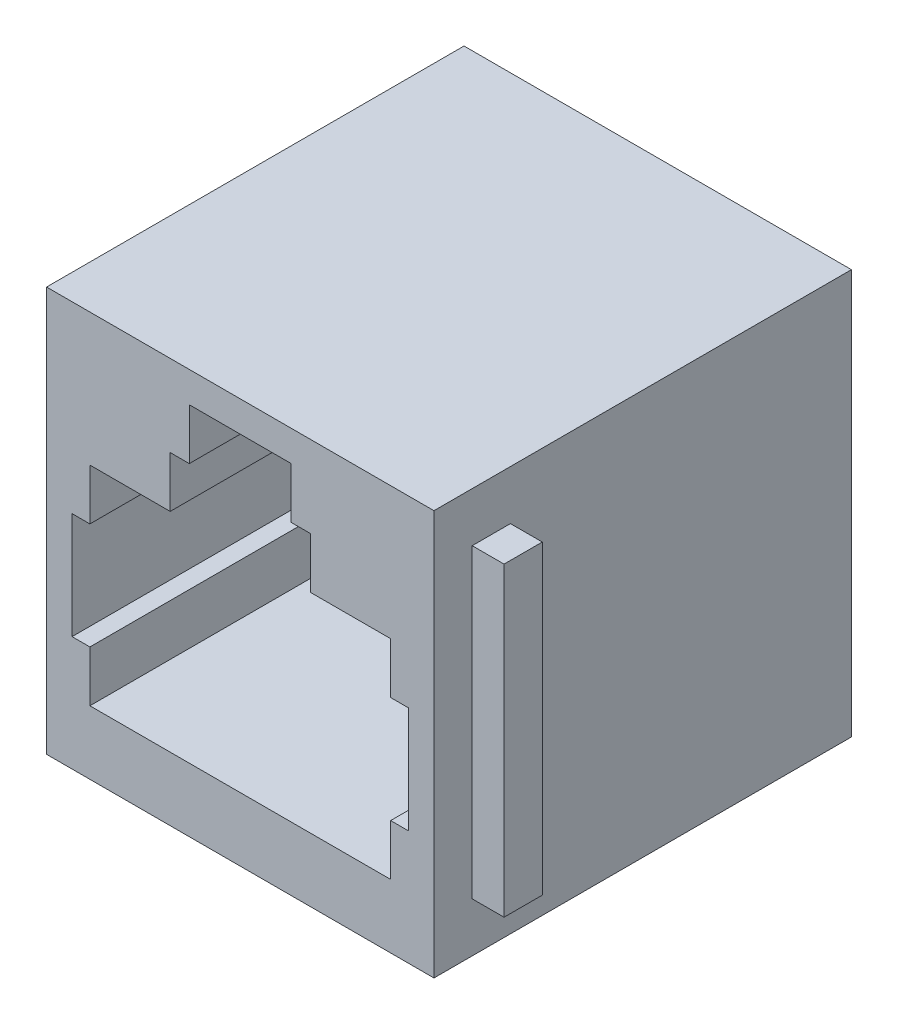
ISO-10303-21;
HEADER;
FILE_DESCRIPTION(('STEP AP214'),'2;1');
FILE_NAME('part.step','',(''),(''),'','','');
FILE_SCHEMA(('AUTOMOTIVE_DESIGN { 1 0 10303 214 1 1 1 1 }'));
ENDSEC;
DATA;
#1=APPLICATION_CONTEXT('core data for automotive mechanical design processes');
#2=APPLICATION_PROTOCOL_DEFINITION('international standard','automotive_design',2000,#1);
#3=PRODUCT_CONTEXT('',#1,'mechanical');
#4=PRODUCT('Part','Part','',(#3));
#5=PRODUCT_RELATED_PRODUCT_CATEGORY('part','',(#4));
#6=PRODUCT_DEFINITION_FORMATION('','',#4);
#7=PRODUCT_DEFINITION_CONTEXT('part definition',#1,'design');
#8=PRODUCT_DEFINITION('design','',#6,#7);
#9=PRODUCT_DEFINITION_SHAPE('','',#8);
#10=(LENGTH_UNIT() NAMED_UNIT(*) SI_UNIT(.MILLI.,.METRE.));
#11=(NAMED_UNIT(*) PLANE_ANGLE_UNIT() SI_UNIT($,.RADIAN.));
#12=(NAMED_UNIT(*) SI_UNIT($,.STERADIAN.) SOLID_ANGLE_UNIT());
#13=UNCERTAINTY_MEASURE_WITH_UNIT(LENGTH_MEASURE(1.E-05),#10,'distance_accuracy_value','');
#14=(GEOMETRIC_REPRESENTATION_CONTEXT(3) GLOBAL_UNCERTAINTY_ASSIGNED_CONTEXT((#13)) GLOBAL_UNIT_ASSIGNED_CONTEXT((#10,
#11,#12)) REPRESENTATION_CONTEXT('',''));
#15=CARTESIAN_POINT('',(0.,0.,0.));
#16=DIRECTION('',(0.,0.,1.));
#17=DIRECTION('',(1.,0.,0.));
#18=AXIS2_PLACEMENT_3D('',#15,#16,#17);
#19=CARTESIAN_POINT('',(-7.6,7.94,16.38));
#20=DIRECTION('',(1.,0.,0.));
#21=DIRECTION('',(0.,1.,0.));
#22=AXIS2_PLACEMENT_3D('',#19,#20,#21);
#23=PLANE('',#22);
#24=DIRECTION('',(0.,-1.,0.));
#25=VECTOR('',#24,1.);
#26=CARTESIAN_POINT('',(-7.6,6.,13.38));
#27=LINE('',#26,#25);
#28=CARTESIAN_POINT('',(-7.6,6.,13.38));
#29=VERTEX_POINT('',#28);
#30=CARTESIAN_POINT('',(-7.6,-6.,13.38));
#31=VERTEX_POINT('',#30);
#32=EDGE_CURVE('E49',#29,#31,#27,.T.);
#33=ORIENTED_EDGE('',*,*,#32,.F.);
#34=DIRECTION('',(0.,0.,-1.));
#35=VECTOR('',#34,1.);
#36=CARTESIAN_POINT('',(-7.6,6.,13.38));
#37=LINE('',#36,#35);
#38=CARTESIAN_POINT('',(-7.6,6.,14.88));
#39=VERTEX_POINT('',#38);
#40=EDGE_CURVE('E53',#39,#29,#37,.T.);
#41=ORIENTED_EDGE('',*,*,#40,.F.);
#42=DIRECTION('',(0.,-1.,0.));
#43=VECTOR('',#42,1.);
#44=CARTESIAN_POINT('',(-7.6,6.,14.88));
#45=LINE('',#44,#43);
#46=CARTESIAN_POINT('',(-7.6,-6.,14.88));
#47=VERTEX_POINT('',#46);
#48=EDGE_CURVE('E266',#39,#47,#45,.T.);
#49=ORIENTED_EDGE('',*,*,#48,.T.);
#50=DIRECTION('',(0.,0.,-1.));
#51=VECTOR('',#50,1.);
#52=CARTESIAN_POINT('',(-7.6,-6.,13.38));
#53=LINE('',#52,#51);
#54=EDGE_CURVE('E257',#47,#31,#53,.T.);
#55=ORIENTED_EDGE('',*,*,#54,.T.);
#56=EDGE_LOOP('',(#33,#41,#49,#55));
#57=FACE_BOUND('',#56,.T.);
#58=DIRECTION('',(0.,-1.,0.));
#59=VECTOR('',#58,1.);
#60=CARTESIAN_POINT('',(-7.6,7.94,0.));
#61=LINE('',#60,#59);
#62=CARTESIAN_POINT('',(-7.6,7.94,0.));
#63=VERTEX_POINT('',#62);
#64=CARTESIAN_POINT('',(-7.6,-7.94,0.));
#65=VERTEX_POINT('',#64);
#66=EDGE_CURVE('E437',#63,#65,#61,.T.);
#67=ORIENTED_EDGE('',*,*,#66,.T.);
#68=DIRECTION('',(0.,0.,-1.));
#69=VECTOR('',#68,1.);
#70=CARTESIAN_POINT('',(-7.6,-7.94,16.38));
#71=LINE('',#70,#69);
#72=CARTESIAN_POINT('',(-7.6,-7.94,16.38));
#73=VERTEX_POINT('',#72);
#74=EDGE_CURVE('E12',#73,#65,#71,.T.);
#75=ORIENTED_EDGE('',*,*,#74,.F.);
#76=DIRECTION('',(0.,-1.,0.));
#77=VECTOR('',#76,1.);
#78=CARTESIAN_POINT('',(-7.6,7.94,16.38));
#79=LINE('',#78,#77);
#80=CARTESIAN_POINT('',(-7.6,7.94,16.38));
#81=VERTEX_POINT('',#80);
#82=EDGE_CURVE('E438',#81,#73,#79,.T.);
#83=ORIENTED_EDGE('',*,*,#82,.F.);
#84=DIRECTION('',(0.,0.,-1.));
#85=VECTOR('',#84,1.);
#86=CARTESIAN_POINT('',(-7.6,7.94,16.38));
#87=LINE('',#86,#85);
#88=EDGE_CURVE('E448',#81,#63,#87,.T.);
#89=ORIENTED_EDGE('',*,*,#88,.T.);
#90=EDGE_LOOP('',(#67,#75,#83,#89));
#91=FACE_BOUND('',#90,.T.);
#92=ADVANCED_FACE('F35',(#57,#91),#23,.F.);
#93=CARTESIAN_POINT('',(-7.6,-7.94,16.38));
#94=DIRECTION('',(0.,1.,0.));
#95=DIRECTION('',(-1.,0.,0.));
#96=AXIS2_PLACEMENT_3D('',#93,#94,#95);
#97=PLANE('',#96);
#98=DIRECTION('',(1.,0.,0.));
#99=VECTOR('',#98,1.);
#100=CARTESIAN_POINT('',(-7.6,-7.94,0.));
#101=LINE('',#100,#99);
#102=CARTESIAN_POINT('',(7.6,-7.94,0.));
#103=VERTEX_POINT('',#102);
#104=EDGE_CURVE('E451',#65,#103,#101,.T.);
#105=ORIENTED_EDGE('',*,*,#104,.T.);
#106=DIRECTION('',(0.,0.,-1.));
#107=VECTOR('',#106,1.);
#108=CARTESIAN_POINT('',(7.6,-7.94,16.38));
#109=LINE('',#108,#107);
#110=CARTESIAN_POINT('',(7.6,-7.94,16.38));
#111=VERTEX_POINT('',#110);
#112=EDGE_CURVE('E42',#111,#103,#109,.T.);
#113=ORIENTED_EDGE('',*,*,#112,.F.);
#114=DIRECTION('',(1.,0.,0.));
#115=VECTOR('',#114,1.);
#116=CARTESIAN_POINT('',(-7.6,-7.94,16.38));
#117=LINE('',#116,#115);
#118=EDGE_CURVE('E441',#73,#111,#117,.T.);
#119=ORIENTED_EDGE('',*,*,#118,.F.);
#120=ORIENTED_EDGE('',*,*,#74,.T.);
#121=EDGE_LOOP('',(#105,#113,#119,#120));
#122=FACE_BOUND('',#121,.T.);
#123=ADVANCED_FACE('F481',(#122),#97,.F.);
#124=CARTESIAN_POINT('',(7.6,7.94,16.38));
#125=DIRECTION('',(-1.,0.,0.));
#126=DIRECTION('',(0.,-1.,0.));
#127=AXIS2_PLACEMENT_3D('',#124,#125,#126);
#128=PLANE('',#127);
#129=DIRECTION('',(0.,-1.,0.));
#130=VECTOR('',#129,1.);
#131=CARTESIAN_POINT('',(7.6,6.,14.88));
#132=LINE('',#131,#130);
#133=CARTESIAN_POINT('',(7.6,6.,14.88));
#134=VERTEX_POINT('',#133);
#135=CARTESIAN_POINT('',(7.6,-6.,14.88));
#136=VERTEX_POINT('',#135);
#137=EDGE_CURVE('E294',#134,#136,#132,.T.);
#138=ORIENTED_EDGE('',*,*,#137,.F.);
#139=DIRECTION('',(0.,0.,1.));
#140=VECTOR('',#139,1.);
#141=CARTESIAN_POINT('',(7.6,6.,13.38));
#142=LINE('',#141,#140);
#143=CARTESIAN_POINT('',(7.6,6.,13.38));
#144=VERTEX_POINT('',#143);
#145=EDGE_CURVE('E270',#144,#134,#142,.T.);
#146=ORIENTED_EDGE('',*,*,#145,.F.);
#147=DIRECTION('',(0.,-1.,0.));
#148=VECTOR('',#147,1.);
#149=CARTESIAN_POINT('',(7.6,6.,13.38));
#150=LINE('',#149,#148);
#151=CARTESIAN_POINT('',(7.6,-6.,13.38));
#152=VERTEX_POINT('',#151);
#153=EDGE_CURVE('E280',#144,#152,#150,.T.);
#154=ORIENTED_EDGE('',*,*,#153,.T.);
#155=DIRECTION('',(0.,0.,1.));
#156=VECTOR('',#155,1.);
#157=CARTESIAN_POINT('',(7.6,-6.,13.38));
#158=LINE('',#157,#156);
#159=EDGE_CURVE('E262',#152,#136,#158,.T.);
#160=ORIENTED_EDGE('',*,*,#159,.T.);
#161=EDGE_LOOP('',(#138,#146,#154,#160));
#162=FACE_BOUND('',#161,.T.);
#163=DIRECTION('',(0.,1.,0.));
#164=VECTOR('',#163,1.);
#165=CARTESIAN_POINT('',(7.6,7.94,0.));
#166=LINE('',#165,#164);
#167=CARTESIAN_POINT('',(7.6,7.94,0.));
#168=VERTEX_POINT('',#167);
#169=EDGE_CURVE('E453',#103,#168,#166,.T.);
#170=ORIENTED_EDGE('',*,*,#169,.T.);
#171=DIRECTION('',(0.,0.,-1.));
#172=VECTOR('',#171,1.);
#173=CARTESIAN_POINT('',(7.6,7.94,16.38));
#174=LINE('',#173,#172);
#175=CARTESIAN_POINT('',(7.6,7.94,16.38));
#176=VERTEX_POINT('',#175);
#177=EDGE_CURVE('E458',#176,#168,#174,.T.);
#178=ORIENTED_EDGE('',*,*,#177,.F.);
#179=DIRECTION('',(0.,1.,0.));
#180=VECTOR('',#179,1.);
#181=CARTESIAN_POINT('',(7.6,7.94,16.38));
#182=LINE('',#181,#180);
#183=EDGE_CURVE('E444',#111,#176,#182,.T.);
#184=ORIENTED_EDGE('',*,*,#183,.F.);
#185=ORIENTED_EDGE('',*,*,#112,.T.);
#186=EDGE_LOOP('',(#170,#178,#184,#185));
#187=FACE_BOUND('',#186,.T.);
#188=ADVANCED_FACE('F465',(#162,#187),#128,.F.);
#189=CARTESIAN_POINT('',(-7.6,7.94,16.38));
#190=DIRECTION('',(0.,-1.,0.));
#191=DIRECTION('',(1.,0.,0.));
#192=AXIS2_PLACEMENT_3D('',#189,#190,#191);
#193=PLANE('',#192);
#194=DIRECTION('',(-1.,0.,0.));
#195=VECTOR('',#194,1.);
#196=CARTESIAN_POINT('',(-7.6,7.94,0.));
#197=LINE('',#196,#195);
#198=EDGE_CURVE('E442',#168,#63,#197,.T.);
#199=ORIENTED_EDGE('',*,*,#198,.T.);
#200=ORIENTED_EDGE('',*,*,#88,.F.);
#201=DIRECTION('',(-1.,0.,0.));
#202=VECTOR('',#201,1.);
#203=CARTESIAN_POINT('',(-7.6,7.94,16.38));
#204=LINE('',#203,#202);
#205=EDGE_CURVE('E446',#176,#81,#204,.T.);
#206=ORIENTED_EDGE('',*,*,#205,.F.);
#207=ORIENTED_EDGE('',*,*,#177,.T.);
#208=EDGE_LOOP('',(#199,#200,#206,#207));
#209=FACE_BOUND('',#208,.T.);
#210=ADVANCED_FACE('F474',(#209),#193,.F.);
#211=CARTESIAN_POINT('',(0.,0.,16.38));
#212=DIRECTION('',(0.,0.,1.));
#213=DIRECTION('',(1.,0.,0.));
#214=AXIS2_PLACEMENT_3D('',#211,#212,#213);
#215=PLANE('',#214);
#216=DIRECTION('',(0.,1.,0.));
#217=VECTOR('',#216,1.);
#218=CARTESIAN_POINT('',(5.9,2.74,16.38));
#219=LINE('',#218,#217);
#220=CARTESIAN_POINT('',(5.9,0.740000000000001,16.38));
#221=VERTEX_POINT('',#220);
#222=CARTESIAN_POINT('',(5.9,2.74,16.38));
#223=VERTEX_POINT('',#222);
#224=EDGE_CURVE('E297',#221,#223,#219,.T.);
#225=ORIENTED_EDGE('',*,*,#224,.F.);
#226=DIRECTION('',(-1.,0.,0.));
#227=VECTOR('',#226,1.);
#228=CARTESIAN_POINT('',(5.9,0.740000000000001,16.38));
#229=LINE('',#228,#227);
#230=CARTESIAN_POINT('',(6.6,0.740000000000001,16.38));
#231=VERTEX_POINT('',#230);
#232=EDGE_CURVE('E393',#231,#221,#229,.T.);
#233=ORIENTED_EDGE('',*,*,#232,.F.);
#234=DIRECTION('',(0.,1.,0.));
#235=VECTOR('',#234,1.);
#236=CARTESIAN_POINT('',(6.6,0.740000000000001,16.38));
#237=LINE('',#236,#235);
#238=CARTESIAN_POINT('',(6.6,-3.44,16.38));
#239=VERTEX_POINT('',#238);
#240=EDGE_CURVE('E390',#239,#231,#237,.T.);
#241=ORIENTED_EDGE('',*,*,#240,.F.);
#242=DIRECTION('',(1.,0.,0.));
#243=VECTOR('',#242,1.);
#244=CARTESIAN_POINT('',(6.6,-3.44,16.38));
#245=LINE('',#244,#243);
#246=CARTESIAN_POINT('',(5.9,-3.44,16.38));
#247=VERTEX_POINT('',#246);
#248=EDGE_CURVE('E387',#247,#239,#245,.T.);
#249=ORIENTED_EDGE('',*,*,#248,.F.);
#250=DIRECTION('',(0.,1.,0.));
#251=VECTOR('',#250,1.);
#252=CARTESIAN_POINT('',(5.9,-3.44,16.38));
#253=LINE('',#252,#251);
#254=CARTESIAN_POINT('',(5.9,-5.44,16.38));
#255=VERTEX_POINT('',#254);
#256=EDGE_CURVE('E384',#255,#247,#253,.T.);
#257=ORIENTED_EDGE('',*,*,#256,.F.);
#258=DIRECTION('',(1.,0.,0.));
#259=VECTOR('',#258,1.);
#260=CARTESIAN_POINT('',(5.9,-5.44,16.38));
#261=LINE('',#260,#259);
#262=CARTESIAN_POINT('',(-5.9,-5.44,16.38));
#263=VERTEX_POINT('',#262);
#264=EDGE_CURVE('E381',#263,#255,#261,.T.);
#265=ORIENTED_EDGE('',*,*,#264,.F.);
#266=DIRECTION('',(0.,-1.,0.));
#267=VECTOR('',#266,1.);
#268=CARTESIAN_POINT('',(-5.9,-3.44,16.38));
#269=LINE('',#268,#267);
#270=CARTESIAN_POINT('',(-5.9,-3.44,16.38));
#271=VERTEX_POINT('',#270);
#272=EDGE_CURVE('E378',#271,#263,#269,.T.);
#273=ORIENTED_EDGE('',*,*,#272,.F.);
#274=DIRECTION('',(1.,0.,0.));
#275=VECTOR('',#274,1.);
#276=CARTESIAN_POINT('',(-6.6,-3.44,16.38));
#277=LINE('',#276,#275);
#278=CARTESIAN_POINT('',(-6.6,-3.44,16.38));
#279=VERTEX_POINT('',#278);
#280=EDGE_CURVE('E375',#279,#271,#277,.T.);
#281=ORIENTED_EDGE('',*,*,#280,.F.);
#282=DIRECTION('',(0.,-1.,0.));
#283=VECTOR('',#282,1.);
#284=CARTESIAN_POINT('',(-6.6,0.740000000000001,16.38));
#285=LINE('',#284,#283);
#286=CARTESIAN_POINT('',(-6.6,0.740000000000001,16.38));
#287=VERTEX_POINT('',#286);
#288=EDGE_CURVE('E372',#287,#279,#285,.T.);
#289=ORIENTED_EDGE('',*,*,#288,.F.);
#290=DIRECTION('',(-1.,0.,0.));
#291=VECTOR('',#290,1.);
#292=CARTESIAN_POINT('',(-5.9,0.740000000000001,16.38));
#293=LINE('',#292,#291);
#294=CARTESIAN_POINT('',(-5.9,0.740000000000001,16.38));
#295=VERTEX_POINT('',#294);
#296=EDGE_CURVE('E369',#295,#287,#293,.T.);
#297=ORIENTED_EDGE('',*,*,#296,.F.);
#298=DIRECTION('',(0.,-1.,0.));
#299=VECTOR('',#298,1.);
#300=CARTESIAN_POINT('',(-5.9,2.74,16.38));
#301=LINE('',#300,#299);
#302=CARTESIAN_POINT('',(-5.9,2.74,16.38));
#303=VERTEX_POINT('',#302);
#304=EDGE_CURVE('E366',#303,#295,#301,.T.);
#305=ORIENTED_EDGE('',*,*,#304,.F.);
#306=DIRECTION('',(-1.,0.,0.));
#307=VECTOR('',#306,1.);
#308=CARTESIAN_POINT('',(-2.75,2.74,16.38));
#309=LINE('',#308,#307);
#310=CARTESIAN_POINT('',(-2.75,2.74,16.38));
#311=VERTEX_POINT('',#310);
#312=EDGE_CURVE('E363',#311,#303,#309,.T.);
#313=ORIENTED_EDGE('',*,*,#312,.F.);
#314=DIRECTION('',(0.,-1.,0.));
#315=VECTOR('',#314,1.);
#316=CARTESIAN_POINT('',(-2.75,4.74,16.38));
#317=LINE('',#316,#315);
#318=CARTESIAN_POINT('',(-2.75,4.74,16.38));
#319=VERTEX_POINT('',#318);
#320=EDGE_CURVE('E360',#319,#311,#317,.T.);
#321=ORIENTED_EDGE('',*,*,#320,.F.);
#322=DIRECTION('',(-1.,0.,0.));
#323=VECTOR('',#322,1.);
#324=CARTESIAN_POINT('',(-2.,4.74,16.38));
#325=LINE('',#324,#323);
#326=CARTESIAN_POINT('',(-2.,4.74,16.38));
#327=VERTEX_POINT('',#326);
#328=EDGE_CURVE('E357',#327,#319,#325,.T.);
#329=ORIENTED_EDGE('',*,*,#328,.F.);
#330=DIRECTION('',(0.,-1.,0.));
#331=VECTOR('',#330,1.);
#332=CARTESIAN_POINT('',(-2.,6.74,16.38));
#333=LINE('',#332,#331);
#334=CARTESIAN_POINT('',(-2.,6.74,16.38));
#335=VERTEX_POINT('',#334);
#336=EDGE_CURVE('E354',#335,#327,#333,.T.);
#337=ORIENTED_EDGE('',*,*,#336,.F.);
#338=DIRECTION('',(-1.,0.,0.));
#339=VECTOR('',#338,1.);
#340=CARTESIAN_POINT('',(-2.,6.74,16.38));
#341=LINE('',#340,#339);
#342=CARTESIAN_POINT('',(2.,6.74,16.38));
#343=VERTEX_POINT('',#342);
#344=EDGE_CURVE('E351',#343,#335,#341,.T.);
#345=ORIENTED_EDGE('',*,*,#344,.F.);
#346=DIRECTION('',(0.,1.,0.));
#347=VECTOR('',#346,1.);
#348=CARTESIAN_POINT('',(2.,6.74,16.38));
#349=LINE('',#348,#347);
#350=CARTESIAN_POINT('',(2.,4.74,16.38));
#351=VERTEX_POINT('',#350);
#352=EDGE_CURVE('E348',#351,#343,#349,.T.);
#353=ORIENTED_EDGE('',*,*,#352,.F.);
#354=DIRECTION('',(-1.,0.,0.));
#355=VECTOR('',#354,1.);
#356=CARTESIAN_POINT('',(2.,4.74,16.38));
#357=LINE('',#356,#355);
#358=CARTESIAN_POINT('',(2.75,4.74,16.38));
#359=VERTEX_POINT('',#358);
#360=EDGE_CURVE('E345',#359,#351,#357,.T.);
#361=ORIENTED_EDGE('',*,*,#360,.F.);
#362=DIRECTION('',(0.,1.,0.));
#363=VECTOR('',#362,1.);
#364=CARTESIAN_POINT('',(2.75,4.74,16.38));
#365=LINE('',#364,#363);
#366=CARTESIAN_POINT('',(2.75,2.74,16.38));
#367=VERTEX_POINT('',#366);
#368=EDGE_CURVE('E342',#367,#359,#365,.T.);
#369=ORIENTED_EDGE('',*,*,#368,.F.);
#370=DIRECTION('',(-1.,0.,0.));
#371=VECTOR('',#370,1.);
#372=CARTESIAN_POINT('',(2.75,2.74,16.38));
#373=LINE('',#372,#371);
#374=EDGE_CURVE('E339',#223,#367,#373,.T.);
#375=ORIENTED_EDGE('',*,*,#374,.F.);
#376=EDGE_LOOP('',(#225,#233,#241,#249,#257,#265,#273,#281,#289,#297,#305,#313,#321,#329,#337,
#345,#353,#361,#369,#375));
#377=FACE_BOUND('',#376,.T.);
#378=ORIENTED_EDGE('',*,*,#82,.T.);
#379=ORIENTED_EDGE('',*,*,#118,.T.);
#380=ORIENTED_EDGE('',*,*,#183,.T.);
#381=ORIENTED_EDGE('',*,*,#205,.T.);
#382=EDGE_LOOP('',(#378,#379,#380,#381));
#383=FACE_BOUND('',#382,.T.);
#384=ADVANCED_FACE('F480',(#377,#383),#215,.T.);
#385=CARTESIAN_POINT('',(0.,0.,0.));
#386=DIRECTION('',(0.,0.,1.));
#387=DIRECTION('',(1.,0.,0.));
#388=AXIS2_PLACEMENT_3D('',#385,#386,#387);
#389=PLANE('',#388);
#390=ORIENTED_EDGE('',*,*,#66,.F.);
#391=ORIENTED_EDGE('',*,*,#198,.F.);
#392=ORIENTED_EDGE('',*,*,#169,.F.);
#393=ORIENTED_EDGE('',*,*,#104,.F.);
#394=EDGE_LOOP('',(#390,#391,#392,#393));
#395=FACE_BOUND('',#394,.T.);
#396=ADVANCED_FACE('F471',(#395),#389,.F.);
#397=CARTESIAN_POINT('',(5.9,2.74,-17.9608574405567));
#398=DIRECTION('',(1.,0.,0.));
#399=DIRECTION('',(0.,0.,-1.));
#400=AXIS2_PLACEMENT_3D('',#397,#398,#399);
#401=PLANE('',#400);
#402=DIRECTION('',(0.,-1.,0.));
#403=VECTOR('',#402,1.);
#404=CARTESIAN_POINT('',(5.9,2.74,1.));
#405=LINE('',#404,#403);
#406=CARTESIAN_POINT('',(5.9,2.74,1.));
#407=VERTEX_POINT('',#406);
#408=CARTESIAN_POINT('',(5.9,0.740000000000001,1.));
#409=VERTEX_POINT('',#408);
#410=EDGE_CURVE('E335',#407,#409,#405,.T.);
#411=ORIENTED_EDGE('',*,*,#410,.T.);
#412=DIRECTION('',(0.,0.,1.));
#413=VECTOR('',#412,1.);
#414=CARTESIAN_POINT('',(5.9,0.740000000000001,-17.9608574405567));
#415=LINE('',#414,#413);
#416=EDGE_CURVE('E301',#409,#221,#415,.T.);
#417=ORIENTED_EDGE('',*,*,#416,.T.);
#418=ORIENTED_EDGE('',*,*,#224,.T.);
#419=DIRECTION('',(0.,0.,1.));
#420=VECTOR('',#419,1.);
#421=CARTESIAN_POINT('',(5.9,2.74,-17.9608574405567));
#422=LINE('',#421,#420);
#423=EDGE_CURVE('E396',#407,#223,#422,.T.);
#424=ORIENTED_EDGE('',*,*,#423,.F.);
#425=EDGE_LOOP('',(#411,#417,#418,#424));
#426=FACE_BOUND('',#425,.T.);
#427=ADVANCED_FACE('F494',(#426),#401,.F.);
#428=CARTESIAN_POINT('',(5.9,0.740000000000001,-17.9608574405567));
#429=DIRECTION('',(0.,1.,0.));
#430=DIRECTION('',(-1.,0.,0.));
#431=AXIS2_PLACEMENT_3D('',#428,#429,#430);
#432=PLANE('',#431);
#433=DIRECTION('',(1.,0.,0.));
#434=VECTOR('',#433,1.);
#435=CARTESIAN_POINT('',(5.9,0.740000000000001,1.));
#436=LINE('',#435,#434);
#437=CARTESIAN_POINT('',(6.6,0.740000000000001,1.));
#438=VERTEX_POINT('',#437);
#439=EDGE_CURVE('E333',#409,#438,#436,.T.);
#440=ORIENTED_EDGE('',*,*,#439,.T.);
#441=DIRECTION('',(0.,0.,1.));
#442=VECTOR('',#441,1.);
#443=CARTESIAN_POINT('',(6.6,0.740000000000001,-17.9608574405567));
#444=LINE('',#443,#442);
#445=EDGE_CURVE('E398',#438,#231,#444,.T.);
#446=ORIENTED_EDGE('',*,*,#445,.T.);
#447=ORIENTED_EDGE('',*,*,#232,.T.);
#448=ORIENTED_EDGE('',*,*,#416,.F.);
#449=EDGE_LOOP('',(#440,#446,#447,#448));
#450=FACE_BOUND('',#449,.T.);
#451=ADVANCED_FACE('F500',(#450),#432,.F.);
#452=CARTESIAN_POINT('',(6.6,0.740000000000001,-17.9608574405567));
#453=DIRECTION('',(1.,0.,0.));
#454=DIRECTION('',(0.,1.,0.));
#455=AXIS2_PLACEMENT_3D('',#452,#453,#454);
#456=PLANE('',#455);
#457=DIRECTION('',(0.,-1.,0.));
#458=VECTOR('',#457,1.);
#459=CARTESIAN_POINT('',(6.6,0.740000000000001,1.));
#460=LINE('',#459,#458);
#461=CARTESIAN_POINT('',(6.6,-3.44,1.));
#462=VERTEX_POINT('',#461);
#463=EDGE_CURVE('E331',#438,#462,#460,.T.);
#464=ORIENTED_EDGE('',*,*,#463,.T.);
#465=DIRECTION('',(0.,0.,1.));
#466=VECTOR('',#465,1.);
#467=CARTESIAN_POINT('',(6.6,-3.44,-17.9608574405567));
#468=LINE('',#467,#466);
#469=EDGE_CURVE('E400',#462,#239,#468,.T.);
#470=ORIENTED_EDGE('',*,*,#469,.T.);
#471=ORIENTED_EDGE('',*,*,#240,.T.);
#472=ORIENTED_EDGE('',*,*,#445,.F.);
#473=EDGE_LOOP('',(#464,#470,#471,#472));
#474=FACE_BOUND('',#473,.T.);
#475=ADVANCED_FACE('F570',(#474),#456,.F.);
#476=CARTESIAN_POINT('',(6.6,-3.44,-17.9608574405567));
#477=DIRECTION('',(0.,-1.,0.));
#478=DIRECTION('',(1.,0.,0.));
#479=AXIS2_PLACEMENT_3D('',#476,#477,#478);
#480=PLANE('',#479);
#481=DIRECTION('',(-1.,0.,0.));
#482=VECTOR('',#481,1.);
#483=CARTESIAN_POINT('',(6.6,-3.44,1.));
#484=LINE('',#483,#482);
#485=CARTESIAN_POINT('',(5.9,-3.44,1.));
#486=VERTEX_POINT('',#485);
#487=EDGE_CURVE('E329',#462,#486,#484,.T.);
#488=ORIENTED_EDGE('',*,*,#487,.T.);
#489=DIRECTION('',(0.,0.,1.));
#490=VECTOR('',#489,1.);
#491=CARTESIAN_POINT('',(5.9,-3.44,-17.9608574405567));
#492=LINE('',#491,#490);
#493=EDGE_CURVE('E402',#486,#247,#492,.T.);
#494=ORIENTED_EDGE('',*,*,#493,.T.);
#495=ORIENTED_EDGE('',*,*,#248,.T.);
#496=ORIENTED_EDGE('',*,*,#469,.F.);
#497=EDGE_LOOP('',(#488,#494,#495,#496));
#498=FACE_BOUND('',#497,.T.);
#499=ADVANCED_FACE('F566',(#498),#480,.F.);
#500=CARTESIAN_POINT('',(5.9,-3.44,-17.9608574405567));
#501=DIRECTION('',(1.,0.,0.));
#502=DIRECTION('',(0.,1.,0.));
#503=AXIS2_PLACEMENT_3D('',#500,#501,#502);
#504=PLANE('',#503);
#505=DIRECTION('',(0.,-1.,0.));
#506=VECTOR('',#505,1.);
#507=CARTESIAN_POINT('',(5.9,-3.44,1.));
#508=LINE('',#507,#506);
#509=CARTESIAN_POINT('',(5.9,-5.44,1.));
#510=VERTEX_POINT('',#509);
#511=EDGE_CURVE('E327',#486,#510,#508,.T.);
#512=ORIENTED_EDGE('',*,*,#511,.T.);
#513=DIRECTION('',(0.,0.,1.));
#514=VECTOR('',#513,1.);
#515=CARTESIAN_POINT('',(5.9,-5.44,-17.9608574405567));
#516=LINE('',#515,#514);
#517=EDGE_CURVE('E404',#510,#255,#516,.T.);
#518=ORIENTED_EDGE('',*,*,#517,.T.);
#519=ORIENTED_EDGE('',*,*,#256,.T.);
#520=ORIENTED_EDGE('',*,*,#493,.F.);
#521=EDGE_LOOP('',(#512,#518,#519,#520));
#522=FACE_BOUND('',#521,.T.);
#523=ADVANCED_FACE('F562',(#522),#504,.F.);
#524=CARTESIAN_POINT('',(5.9,-5.44,-17.9608574405567));
#525=DIRECTION('',(0.,-1.,0.));
#526=DIRECTION('',(0.,0.,-1.));
#527=AXIS2_PLACEMENT_3D('',#524,#525,#526);
#528=PLANE('',#527);
#529=DIRECTION('',(-1.,0.,0.));
#530=VECTOR('',#529,1.);
#531=CARTESIAN_POINT('',(5.9,-5.44,1.));
#532=LINE('',#531,#530);
#533=CARTESIAN_POINT('',(-5.9,-5.44,1.));
#534=VERTEX_POINT('',#533);
#535=EDGE_CURVE('E325',#510,#534,#532,.T.);
#536=ORIENTED_EDGE('',*,*,#535,.T.);
#537=DIRECTION('',(0.,0.,1.));
#538=VECTOR('',#537,1.);
#539=CARTESIAN_POINT('',(-5.9,-5.44,-17.9608574405567));
#540=LINE('',#539,#538);
#541=EDGE_CURVE('E406',#534,#263,#540,.T.);
#542=ORIENTED_EDGE('',*,*,#541,.T.);
#543=ORIENTED_EDGE('',*,*,#264,.T.);
#544=ORIENTED_EDGE('',*,*,#517,.F.);
#545=EDGE_LOOP('',(#536,#542,#543,#544));
#546=FACE_BOUND('',#545,.T.);
#547=ADVANCED_FACE('F558',(#546),#528,.F.);
#548=CARTESIAN_POINT('',(-5.9,-3.44,-17.9608574405567));
#549=DIRECTION('',(-1.,0.,0.));
#550=DIRECTION('',(0.,-1.,0.));
#551=AXIS2_PLACEMENT_3D('',#548,#549,#550);
#552=PLANE('',#551);
#553=DIRECTION('',(0.,1.,0.));
#554=VECTOR('',#553,1.);
#555=CARTESIAN_POINT('',(-5.9,-3.44,1.));
#556=LINE('',#555,#554);
#557=CARTESIAN_POINT('',(-5.9,-3.44,1.));
#558=VERTEX_POINT('',#557);
#559=EDGE_CURVE('E323',#534,#558,#556,.T.);
#560=ORIENTED_EDGE('',*,*,#559,.T.);
#561=DIRECTION('',(0.,0.,1.));
#562=VECTOR('',#561,1.);
#563=CARTESIAN_POINT('',(-5.9,-3.44,-17.9608574405567));
#564=LINE('',#563,#562);
#565=EDGE_CURVE('E408',#558,#271,#564,.T.);
#566=ORIENTED_EDGE('',*,*,#565,.T.);
#567=ORIENTED_EDGE('',*,*,#272,.T.);
#568=ORIENTED_EDGE('',*,*,#541,.F.);
#569=EDGE_LOOP('',(#560,#566,#567,#568));
#570=FACE_BOUND('',#569,.T.);
#571=ADVANCED_FACE('F554',(#570),#552,.F.);
#572=CARTESIAN_POINT('',(-6.6,-3.44,-17.9608574405567));
#573=DIRECTION('',(0.,-1.,0.));
#574=DIRECTION('',(1.,0.,0.));
#575=AXIS2_PLACEMENT_3D('',#572,#573,#574);
#576=PLANE('',#575);
#577=DIRECTION('',(-1.,0.,0.));
#578=VECTOR('',#577,1.);
#579=CARTESIAN_POINT('',(-6.6,-3.44,1.));
#580=LINE('',#579,#578);
#581=CARTESIAN_POINT('',(-6.6,-3.44,1.));
#582=VERTEX_POINT('',#581);
#583=EDGE_CURVE('E321',#558,#582,#580,.T.);
#584=ORIENTED_EDGE('',*,*,#583,.T.);
#585=DIRECTION('',(0.,0.,1.));
#586=VECTOR('',#585,1.);
#587=CARTESIAN_POINT('',(-6.6,-3.44,-17.9608574405567));
#588=LINE('',#587,#586);
#589=EDGE_CURVE('E410',#582,#279,#588,.T.);
#590=ORIENTED_EDGE('',*,*,#589,.T.);
#591=ORIENTED_EDGE('',*,*,#280,.T.);
#592=ORIENTED_EDGE('',*,*,#565,.F.);
#593=EDGE_LOOP('',(#584,#590,#591,#592));
#594=FACE_BOUND('',#593,.T.);
#595=ADVANCED_FACE('F550',(#594),#576,.F.);
#596=CARTESIAN_POINT('',(-6.6,0.740000000000001,-17.9608574405567));
#597=DIRECTION('',(-1.,0.,0.));
#598=DIRECTION('',(0.,-1.,0.));
#599=AXIS2_PLACEMENT_3D('',#596,#597,#598);
#600=PLANE('',#599);
#601=DIRECTION('',(0.,1.,0.));
#602=VECTOR('',#601,1.);
#603=CARTESIAN_POINT('',(-6.6,0.740000000000001,1.));
#604=LINE('',#603,#602);
#605=CARTESIAN_POINT('',(-6.6,0.740000000000001,1.));
#606=VERTEX_POINT('',#605);
#607=EDGE_CURVE('E319',#582,#606,#604,.T.);
#608=ORIENTED_EDGE('',*,*,#607,.T.);
#609=DIRECTION('',(0.,0.,1.));
#610=VECTOR('',#609,1.);
#611=CARTESIAN_POINT('',(-6.6,0.740000000000001,-17.9608574405567));
#612=LINE('',#611,#610);
#613=EDGE_CURVE('E412',#606,#287,#612,.T.);
#614=ORIENTED_EDGE('',*,*,#613,.T.);
#615=ORIENTED_EDGE('',*,*,#288,.T.);
#616=ORIENTED_EDGE('',*,*,#589,.F.);
#617=EDGE_LOOP('',(#608,#614,#615,#616));
#618=FACE_BOUND('',#617,.T.);
#619=ADVANCED_FACE('F546',(#618),#600,.F.);
#620=CARTESIAN_POINT('',(-5.9,0.740000000000001,-17.9608574405567));
#621=DIRECTION('',(0.,1.,0.));
#622=DIRECTION('',(-1.,0.,0.));
#623=AXIS2_PLACEMENT_3D('',#620,#621,#622);
#624=PLANE('',#623);
#625=DIRECTION('',(1.,0.,0.));
#626=VECTOR('',#625,1.);
#627=CARTESIAN_POINT('',(-5.9,0.740000000000001,1.));
#628=LINE('',#627,#626);
#629=CARTESIAN_POINT('',(-5.9,0.740000000000001,1.));
#630=VERTEX_POINT('',#629);
#631=EDGE_CURVE('E317',#606,#630,#628,.T.);
#632=ORIENTED_EDGE('',*,*,#631,.T.);
#633=DIRECTION('',(0.,0.,1.));
#634=VECTOR('',#633,1.);
#635=CARTESIAN_POINT('',(-5.9,0.740000000000001,-17.9608574405567));
#636=LINE('',#635,#634);
#637=EDGE_CURVE('E414',#630,#295,#636,.T.);
#638=ORIENTED_EDGE('',*,*,#637,.T.);
#639=ORIENTED_EDGE('',*,*,#296,.T.);
#640=ORIENTED_EDGE('',*,*,#613,.F.);
#641=EDGE_LOOP('',(#632,#638,#639,#640));
#642=FACE_BOUND('',#641,.T.);
#643=ADVANCED_FACE('F542',(#642),#624,.F.);
#644=CARTESIAN_POINT('',(-5.9,2.74,-17.9608574405567));
#645=DIRECTION('',(-1.,0.,0.));
#646=DIRECTION('',(0.,0.,1.));
#647=AXIS2_PLACEMENT_3D('',#644,#645,#646);
#648=PLANE('',#647);
#649=DIRECTION('',(0.,1.,0.));
#650=VECTOR('',#649,1.);
#651=CARTESIAN_POINT('',(-5.9,2.74,1.));
#652=LINE('',#651,#650);
#653=CARTESIAN_POINT('',(-5.9,2.74,1.));
#654=VERTEX_POINT('',#653);
#655=EDGE_CURVE('E315',#630,#654,#652,.T.);
#656=ORIENTED_EDGE('',*,*,#655,.T.);
#657=DIRECTION('',(0.,0.,1.));
#658=VECTOR('',#657,1.);
#659=CARTESIAN_POINT('',(-5.9,2.74,-17.9608574405567));
#660=LINE('',#659,#658);
#661=EDGE_CURVE('E416',#654,#303,#660,.T.);
#662=ORIENTED_EDGE('',*,*,#661,.T.);
#663=ORIENTED_EDGE('',*,*,#304,.T.);
#664=ORIENTED_EDGE('',*,*,#637,.F.);
#665=EDGE_LOOP('',(#656,#662,#663,#664));
#666=FACE_BOUND('',#665,.T.);
#667=ADVANCED_FACE('F538',(#666),#648,.F.);
#668=CARTESIAN_POINT('',(-2.75,2.74,-17.9608574405567));
#669=DIRECTION('',(0.,1.,0.));
#670=DIRECTION('',(0.,0.,1.));
#671=AXIS2_PLACEMENT_3D('',#668,#669,#670);
#672=PLANE('',#671);
#673=DIRECTION('',(1.,0.,0.));
#674=VECTOR('',#673,1.);
#675=CARTESIAN_POINT('',(-2.75,2.74,1.));
#676=LINE('',#675,#674);
#677=CARTESIAN_POINT('',(-2.75,2.74,1.));
#678=VERTEX_POINT('',#677);
#679=EDGE_CURVE('E313',#654,#678,#676,.T.);
#680=ORIENTED_EDGE('',*,*,#679,.T.);
#681=DIRECTION('',(0.,0.,1.));
#682=VECTOR('',#681,1.);
#683=CARTESIAN_POINT('',(-2.75,2.74,-17.9608574405567));
#684=LINE('',#683,#682);
#685=EDGE_CURVE('E418',#678,#311,#684,.T.);
#686=ORIENTED_EDGE('',*,*,#685,.T.);
#687=ORIENTED_EDGE('',*,*,#312,.T.);
#688=ORIENTED_EDGE('',*,*,#661,.F.);
#689=EDGE_LOOP('',(#680,#686,#687,#688));
#690=FACE_BOUND('',#689,.T.);
#691=ADVANCED_FACE('F534',(#690),#672,.F.);
#692=CARTESIAN_POINT('',(-2.75,4.74,-17.9608574405567));
#693=DIRECTION('',(-1.,0.,0.));
#694=DIRECTION('',(0.,-1.,0.));
#695=AXIS2_PLACEMENT_3D('',#692,#693,#694);
#696=PLANE('',#695);
#697=DIRECTION('',(0.,1.,0.));
#698=VECTOR('',#697,1.);
#699=CARTESIAN_POINT('',(-2.75,4.74,1.));
#700=LINE('',#699,#698);
#701=CARTESIAN_POINT('',(-2.75,4.74,1.));
#702=VERTEX_POINT('',#701);
#703=EDGE_CURVE('E311',#678,#702,#700,.T.);
#704=ORIENTED_EDGE('',*,*,#703,.T.);
#705=DIRECTION('',(0.,0.,1.));
#706=VECTOR('',#705,1.);
#707=CARTESIAN_POINT('',(-2.75,4.74,-17.9608574405567));
#708=LINE('',#707,#706);
#709=EDGE_CURVE('E420',#702,#319,#708,.T.);
#710=ORIENTED_EDGE('',*,*,#709,.T.);
#711=ORIENTED_EDGE('',*,*,#320,.T.);
#712=ORIENTED_EDGE('',*,*,#685,.F.);
#713=EDGE_LOOP('',(#704,#710,#711,#712));
#714=FACE_BOUND('',#713,.T.);
#715=ADVANCED_FACE('F530',(#714),#696,.F.);
#716=CARTESIAN_POINT('',(-2.,4.74,-17.9608574405567));
#717=DIRECTION('',(0.,1.,0.));
#718=DIRECTION('',(0.,0.,1.));
#719=AXIS2_PLACEMENT_3D('',#716,#717,#718);
#720=PLANE('',#719);
#721=DIRECTION('',(1.,0.,0.));
#722=VECTOR('',#721,1.);
#723=CARTESIAN_POINT('',(-2.,4.74,1.));
#724=LINE('',#723,#722);
#725=CARTESIAN_POINT('',(-2.,4.74,1.));
#726=VERTEX_POINT('',#725);
#727=EDGE_CURVE('E309',#702,#726,#724,.T.);
#728=ORIENTED_EDGE('',*,*,#727,.T.);
#729=DIRECTION('',(0.,0.,1.));
#730=VECTOR('',#729,1.);
#731=CARTESIAN_POINT('',(-2.,4.74,-17.9608574405567));
#732=LINE('',#731,#730);
#733=EDGE_CURVE('E422',#726,#327,#732,.T.);
#734=ORIENTED_EDGE('',*,*,#733,.T.);
#735=ORIENTED_EDGE('',*,*,#328,.T.);
#736=ORIENTED_EDGE('',*,*,#709,.F.);
#737=EDGE_LOOP('',(#728,#734,#735,#736));
#738=FACE_BOUND('',#737,.T.);
#739=ADVANCED_FACE('F526',(#738),#720,.F.);
#740=CARTESIAN_POINT('',(-2.,6.74,-17.9608574405567));
#741=DIRECTION('',(-1.,0.,0.));
#742=DIRECTION('',(0.,-1.,0.));
#743=AXIS2_PLACEMENT_3D('',#740,#741,#742);
#744=PLANE('',#743);
#745=DIRECTION('',(0.,1.,0.));
#746=VECTOR('',#745,1.);
#747=CARTESIAN_POINT('',(-2.,6.74,1.));
#748=LINE('',#747,#746);
#749=CARTESIAN_POINT('',(-2.,6.74,1.));
#750=VERTEX_POINT('',#749);
#751=EDGE_CURVE('E307',#726,#750,#748,.T.);
#752=ORIENTED_EDGE('',*,*,#751,.T.);
#753=DIRECTION('',(0.,0.,1.));
#754=VECTOR('',#753,1.);
#755=CARTESIAN_POINT('',(-2.,6.74,-17.9608574405567));
#756=LINE('',#755,#754);
#757=EDGE_CURVE('E424',#750,#335,#756,.T.);
#758=ORIENTED_EDGE('',*,*,#757,.T.);
#759=ORIENTED_EDGE('',*,*,#336,.T.);
#760=ORIENTED_EDGE('',*,*,#733,.F.);
#761=EDGE_LOOP('',(#752,#758,#759,#760));
#762=FACE_BOUND('',#761,.T.);
#763=ADVANCED_FACE('F522',(#762),#744,.F.);
#764=CARTESIAN_POINT('',(-2.,6.74,-17.9608574405567));
#765=DIRECTION('',(0.,1.,0.));
#766=DIRECTION('',(0.,0.,1.));
#767=AXIS2_PLACEMENT_3D('',#764,#765,#766);
#768=PLANE('',#767);
#769=DIRECTION('',(1.,0.,0.));
#770=VECTOR('',#769,1.);
#771=CARTESIAN_POINT('',(-2.,6.74,1.));
#772=LINE('',#771,#770);
#773=CARTESIAN_POINT('',(2.,6.74,1.));
#774=VERTEX_POINT('',#773);
#775=EDGE_CURVE('E305',#750,#774,#772,.T.);
#776=ORIENTED_EDGE('',*,*,#775,.T.);
#777=DIRECTION('',(0.,0.,1.));
#778=VECTOR('',#777,1.);
#779=CARTESIAN_POINT('',(2.,6.74,-17.9608574405567));
#780=LINE('',#779,#778);
#781=EDGE_CURVE('E426',#774,#343,#780,.T.);
#782=ORIENTED_EDGE('',*,*,#781,.T.);
#783=ORIENTED_EDGE('',*,*,#344,.T.);
#784=ORIENTED_EDGE('',*,*,#757,.F.);
#785=EDGE_LOOP('',(#776,#782,#783,#784));
#786=FACE_BOUND('',#785,.T.);
#787=ADVANCED_FACE('F518',(#786),#768,.F.);
#788=CARTESIAN_POINT('',(2.,6.74,-17.9608574405567));
#789=DIRECTION('',(1.,0.,0.));
#790=DIRECTION('',(0.,1.,0.));
#791=AXIS2_PLACEMENT_3D('',#788,#789,#790);
#792=PLANE('',#791);
#793=DIRECTION('',(0.,-1.,0.));
#794=VECTOR('',#793,1.);
#795=CARTESIAN_POINT('',(2.,6.74,1.));
#796=LINE('',#795,#794);
#797=CARTESIAN_POINT('',(2.,4.74,1.));
#798=VERTEX_POINT('',#797);
#799=EDGE_CURVE('E303',#774,#798,#796,.T.);
#800=ORIENTED_EDGE('',*,*,#799,.T.);
#801=DIRECTION('',(0.,0.,1.));
#802=VECTOR('',#801,1.);
#803=CARTESIAN_POINT('',(2.,4.74,-17.9608574405567));
#804=LINE('',#803,#802);
#805=EDGE_CURVE('E428',#798,#351,#804,.T.);
#806=ORIENTED_EDGE('',*,*,#805,.T.);
#807=ORIENTED_EDGE('',*,*,#352,.T.);
#808=ORIENTED_EDGE('',*,*,#781,.F.);
#809=EDGE_LOOP('',(#800,#806,#807,#808));
#810=FACE_BOUND('',#809,.T.);
#811=ADVANCED_FACE('F514',(#810),#792,.F.);
#812=CARTESIAN_POINT('',(2.,4.74,-17.9608574405567));
#813=DIRECTION('',(0.,1.,0.));
#814=DIRECTION('',(0.,0.,1.));
#815=AXIS2_PLACEMENT_3D('',#812,#813,#814);
#816=PLANE('',#815);
#817=DIRECTION('',(1.,0.,0.));
#818=VECTOR('',#817,1.);
#819=CARTESIAN_POINT('',(2.,4.74,1.));
#820=LINE('',#819,#818);
#821=CARTESIAN_POINT('',(2.75,4.74,1.));
#822=VERTEX_POINT('',#821);
#823=EDGE_CURVE('E300',#798,#822,#820,.T.);
#824=ORIENTED_EDGE('',*,*,#823,.T.);
#825=DIRECTION('',(0.,0.,1.));
#826=VECTOR('',#825,1.);
#827=CARTESIAN_POINT('',(2.75,4.74,-17.9608574405567));
#828=LINE('',#827,#826);
#829=EDGE_CURVE('E430',#822,#359,#828,.T.);
#830=ORIENTED_EDGE('',*,*,#829,.T.);
#831=ORIENTED_EDGE('',*,*,#360,.T.);
#832=ORIENTED_EDGE('',*,*,#805,.F.);
#833=EDGE_LOOP('',(#824,#830,#831,#832));
#834=FACE_BOUND('',#833,.T.);
#835=ADVANCED_FACE('F510',(#834),#816,.F.);
#836=CARTESIAN_POINT('',(2.75,4.74,-17.9608574405567));
#837=DIRECTION('',(1.,0.,0.));
#838=DIRECTION('',(0.,1.,0.));
#839=AXIS2_PLACEMENT_3D('',#836,#837,#838);
#840=PLANE('',#839);
#841=DIRECTION('',(0.,-1.,0.));
#842=VECTOR('',#841,1.);
#843=CARTESIAN_POINT('',(2.75,4.74,1.));
#844=LINE('',#843,#842);
#845=CARTESIAN_POINT('',(2.75,2.74,1.));
#846=VERTEX_POINT('',#845);
#847=EDGE_CURVE('E298',#822,#846,#844,.T.);
#848=ORIENTED_EDGE('',*,*,#847,.T.);
#849=DIRECTION('',(0.,0.,1.));
#850=VECTOR('',#849,1.);
#851=CARTESIAN_POINT('',(2.75,2.74,-17.9608574405567));
#852=LINE('',#851,#850);
#853=EDGE_CURVE('E432',#846,#367,#852,.T.);
#854=ORIENTED_EDGE('',*,*,#853,.T.);
#855=ORIENTED_EDGE('',*,*,#368,.T.);
#856=ORIENTED_EDGE('',*,*,#829,.F.);
#857=EDGE_LOOP('',(#848,#854,#855,#856));
#858=FACE_BOUND('',#857,.T.);
#859=ADVANCED_FACE('F506',(#858),#840,.F.);
#860=CARTESIAN_POINT('',(2.75,2.74,-17.9608574405567));
#861=DIRECTION('',(0.,1.,0.));
#862=DIRECTION('',(0.,0.,1.));
#863=AXIS2_PLACEMENT_3D('',#860,#861,#862);
#864=PLANE('',#863);
#865=DIRECTION('',(1.,0.,0.));
#866=VECTOR('',#865,1.);
#867=CARTESIAN_POINT('',(2.75,2.74,1.));
#868=LINE('',#867,#866);
#869=EDGE_CURVE('E337',#846,#407,#868,.T.);
#870=ORIENTED_EDGE('',*,*,#869,.T.);
#871=ORIENTED_EDGE('',*,*,#423,.T.);
#872=ORIENTED_EDGE('',*,*,#374,.T.);
#873=ORIENTED_EDGE('',*,*,#853,.F.);
#874=EDGE_LOOP('',(#870,#871,#872,#873));
#875=FACE_BOUND('',#874,.T.);
#876=ADVANCED_FACE('F502',(#875),#864,.F.);
#877=CARTESIAN_POINT('',(0.,0.,1.));
#878=DIRECTION('',(0.,0.,1.));
#879=DIRECTION('',(1.,0.,0.));
#880=AXIS2_PLACEMENT_3D('',#877,#878,#879);
#881=PLANE('',#880);
#882=ORIENTED_EDGE('',*,*,#410,.F.);
#883=ORIENTED_EDGE('',*,*,#869,.F.);
#884=ORIENTED_EDGE('',*,*,#847,.F.);
#885=ORIENTED_EDGE('',*,*,#823,.F.);
#886=ORIENTED_EDGE('',*,*,#799,.F.);
#887=ORIENTED_EDGE('',*,*,#775,.F.);
#888=ORIENTED_EDGE('',*,*,#751,.F.);
#889=ORIENTED_EDGE('',*,*,#727,.F.);
#890=ORIENTED_EDGE('',*,*,#703,.F.);
#891=ORIENTED_EDGE('',*,*,#679,.F.);
#892=ORIENTED_EDGE('',*,*,#655,.F.);
#893=ORIENTED_EDGE('',*,*,#631,.F.);
#894=ORIENTED_EDGE('',*,*,#607,.F.);
#895=ORIENTED_EDGE('',*,*,#583,.F.);
#896=ORIENTED_EDGE('',*,*,#559,.F.);
#897=ORIENTED_EDGE('',*,*,#535,.F.);
#898=ORIENTED_EDGE('',*,*,#511,.F.);
#899=ORIENTED_EDGE('',*,*,#487,.F.);
#900=ORIENTED_EDGE('',*,*,#463,.F.);
#901=ORIENTED_EDGE('',*,*,#439,.F.);
#902=EDGE_LOOP('',(#882,#883,#884,#885,#886,#887,#888,#889,#890,#891,#892,#893,#894,#895,#896,
#897,#898,#899,#900,#901));
#903=FACE_BOUND('',#902,.T.);
#904=ADVANCED_FACE('F505',(#903),#881,.T.);
#905=CARTESIAN_POINT('',(7.6,6.,14.88));
#906=DIRECTION('',(0.,0.,-1.));
#907=DIRECTION('',(-1.,0.,0.));
#908=AXIS2_PLACEMENT_3D('',#905,#906,#907);
#909=PLANE('',#908);
#910=DIRECTION('',(1.,0.,0.));
#911=VECTOR('',#910,1.);
#912=CARTESIAN_POINT('',(7.6,-6.,14.88));
#913=LINE('',#912,#911);
#914=CARTESIAN_POINT('',(8.85,-6.,14.88));
#915=VERTEX_POINT('',#914);
#916=EDGE_CURVE('E264',#136,#915,#913,.T.);
#917=ORIENTED_EDGE('',*,*,#916,.T.);
#918=DIRECTION('',(0.,-1.,0.));
#919=VECTOR('',#918,1.);
#920=CARTESIAN_POINT('',(8.85,6.,14.88));
#921=LINE('',#920,#919);
#922=CARTESIAN_POINT('',(8.85,6.,14.88));
#923=VERTEX_POINT('',#922);
#924=EDGE_CURVE('E291',#923,#915,#921,.T.);
#925=ORIENTED_EDGE('',*,*,#924,.F.);
#926=DIRECTION('',(1.,0.,0.));
#927=VECTOR('',#926,1.);
#928=CARTESIAN_POINT('',(7.6,6.,14.88));
#929=LINE('',#928,#927);
#930=EDGE_CURVE('E273',#134,#923,#929,.T.);
#931=ORIENTED_EDGE('',*,*,#930,.F.);
#932=ORIENTED_EDGE('',*,*,#137,.T.);
#933=EDGE_LOOP('',(#917,#925,#931,#932));
#934=FACE_BOUND('',#933,.T.);
#935=ADVANCED_FACE('F580',(#934),#909,.F.);
#936=CARTESIAN_POINT('',(8.85,6.,13.38));
#937=DIRECTION('',(-1.,0.,0.));
#938=DIRECTION('',(0.,0.,1.));
#939=AXIS2_PLACEMENT_3D('',#936,#937,#938);
#940=PLANE('',#939);
#941=DIRECTION('',(0.,0.,-1.));
#942=VECTOR('',#941,1.);
#943=CARTESIAN_POINT('',(8.85,-6.,13.38));
#944=LINE('',#943,#942);
#945=CARTESIAN_POINT('',(8.85,-6.,13.38));
#946=VERTEX_POINT('',#945);
#947=EDGE_CURVE('E283',#915,#946,#944,.T.);
#948=ORIENTED_EDGE('',*,*,#947,.T.);
#949=DIRECTION('',(0.,-1.,0.));
#950=VECTOR('',#949,1.);
#951=CARTESIAN_POINT('',(8.85,6.,13.38));
#952=LINE('',#951,#950);
#953=CARTESIAN_POINT('',(8.85,6.,13.38));
#954=VERTEX_POINT('',#953);
#955=EDGE_CURVE('E288',#954,#946,#952,.T.);
#956=ORIENTED_EDGE('',*,*,#955,.F.);
#957=DIRECTION('',(0.,0.,-1.));
#958=VECTOR('',#957,1.);
#959=CARTESIAN_POINT('',(8.85,6.,13.38));
#960=LINE('',#959,#958);
#961=EDGE_CURVE('E276',#923,#954,#960,.T.);
#962=ORIENTED_EDGE('',*,*,#961,.F.);
#963=ORIENTED_EDGE('',*,*,#924,.T.);
#964=EDGE_LOOP('',(#948,#956,#962,#963));
#965=FACE_BOUND('',#964,.T.);
#966=ADVANCED_FACE('F584',(#965),#940,.F.);
#967=CARTESIAN_POINT('',(7.6,6.,13.38));
#968=DIRECTION('',(0.,0.,1.));
#969=DIRECTION('',(1.,0.,0.));
#970=AXIS2_PLACEMENT_3D('',#967,#968,#969);
#971=PLANE('',#970);
#972=DIRECTION('',(-1.,0.,0.));
#973=VECTOR('',#972,1.);
#974=CARTESIAN_POINT('',(7.6,-6.,13.38));
#975=LINE('',#974,#973);
#976=EDGE_CURVE('E274',#946,#152,#975,.T.);
#977=ORIENTED_EDGE('',*,*,#976,.T.);
#978=ORIENTED_EDGE('',*,*,#153,.F.);
#979=DIRECTION('',(-1.,0.,0.));
#980=VECTOR('',#979,1.);
#981=CARTESIAN_POINT('',(7.6,6.,13.38));
#982=LINE('',#981,#980);
#983=EDGE_CURVE('E278',#954,#144,#982,.T.);
#984=ORIENTED_EDGE('',*,*,#983,.F.);
#985=ORIENTED_EDGE('',*,*,#955,.T.);
#986=EDGE_LOOP('',(#977,#978,#984,#985));
#987=FACE_BOUND('',#986,.T.);
#988=ADVANCED_FACE('F588',(#987),#971,.F.);
#989=CARTESIAN_POINT('',(0.,6.,0.));
#990=DIRECTION('',(0.,1.,0.));
#991=DIRECTION('',(0.,0.,1.));
#992=AXIS2_PLACEMENT_3D('',#989,#990,#991);
#993=PLANE('',#992);
#994=ORIENTED_EDGE('',*,*,#145,.T.);
#995=ORIENTED_EDGE('',*,*,#930,.T.);
#996=ORIENTED_EDGE('',*,*,#961,.T.);
#997=ORIENTED_EDGE('',*,*,#983,.T.);
#998=EDGE_LOOP('',(#994,#995,#996,#997));
#999=FACE_BOUND('',#998,.T.);
#1000=ADVANCED_FACE('F592',(#999),#993,.T.);
#1001=CARTESIAN_POINT('',(0.,-6.,0.));
#1002=DIRECTION('',(0.,1.,0.));
#1003=DIRECTION('',(0.,0.,1.));
#1004=AXIS2_PLACEMENT_3D('',#1001,#1002,#1003);
#1005=PLANE('',#1004);
#1006=ORIENTED_EDGE('',*,*,#159,.F.);
#1007=ORIENTED_EDGE('',*,*,#976,.F.);
#1008=ORIENTED_EDGE('',*,*,#947,.F.);
#1009=ORIENTED_EDGE('',*,*,#916,.F.);
#1010=EDGE_LOOP('',(#1006,#1007,#1008,#1009));
#1011=FACE_BOUND('',#1010,.T.);
#1012=ADVANCED_FACE('F594',(#1011),#1005,.F.);
#1013=CARTESIAN_POINT('',(-7.6,6.,13.38));
#1014=DIRECTION('',(0.,0.,1.));
#1015=DIRECTION('',(1.,0.,0.));
#1016=AXIS2_PLACEMENT_3D('',#1013,#1014,#1015);
#1017=PLANE('',#1016);
#1018=DIRECTION('',(-1.,0.,0.));
#1019=VECTOR('',#1018,1.);
#1020=CARTESIAN_POINT('',(-7.6,-6.,13.38));
#1021=LINE('',#1020,#1019);
#1022=CARTESIAN_POINT('',(-8.85,-6.,13.38));
#1023=VERTEX_POINT('',#1022);
#1024=EDGE_CURVE('E261',#31,#1023,#1021,.T.);
#1025=ORIENTED_EDGE('',*,*,#1024,.T.);
#1026=DIRECTION('',(0.,-1.,0.));
#1027=VECTOR('',#1026,1.);
#1028=CARTESIAN_POINT('',(-8.85,6.,13.38));
#1029=LINE('',#1028,#1027);
#1030=CARTESIAN_POINT('',(-8.85,6.,13.38));
#1031=VERTEX_POINT('',#1030);
#1032=EDGE_CURVE('E245',#1031,#1023,#1029,.T.);
#1033=ORIENTED_EDGE('',*,*,#1032,.F.);
#1034=DIRECTION('',(-1.,0.,0.));
#1035=VECTOR('',#1034,1.);
#1036=CARTESIAN_POINT('',(-7.6,6.,13.38));
#1037=LINE('',#1036,#1035);
#1038=EDGE_CURVE('E252',#29,#1031,#1037,.T.);
#1039=ORIENTED_EDGE('',*,*,#1038,.F.);
#1040=ORIENTED_EDGE('',*,*,#32,.T.);
#1041=EDGE_LOOP('',(#1025,#1033,#1039,#1040));
#1042=FACE_BOUND('',#1041,.T.);
#1043=ADVANCED_FACE('F259',(#1042),#1017,.F.);
#1044=CARTESIAN_POINT('',(-8.85,6.,13.38));
#1045=DIRECTION('',(1.,0.,0.));
#1046=DIRECTION('',(0.,0.,-1.));
#1047=AXIS2_PLACEMENT_3D('',#1044,#1045,#1046);
#1048=PLANE('',#1047);
#1049=DIRECTION('',(0.,0.,1.));
#1050=VECTOR('',#1049,1.);
#1051=CARTESIAN_POINT('',(-8.85,-6.,13.38));
#1052=LINE('',#1051,#1050);
#1053=CARTESIAN_POINT('',(-8.85,-6.,14.88));
#1054=VERTEX_POINT('',#1053);
#1055=EDGE_CURVE('E836',#1023,#1054,#1052,.T.);
#1056=ORIENTED_EDGE('',*,*,#1055,.T.);
#1057=DIRECTION('',(0.,-1.,0.));
#1058=VECTOR('',#1057,1.);
#1059=CARTESIAN_POINT('',(-8.85,6.,14.88));
#1060=LINE('',#1059,#1058);
#1061=CARTESIAN_POINT('',(-8.85,6.,14.88));
#1062=VERTEX_POINT('',#1061);
#1063=EDGE_CURVE('E248',#1062,#1054,#1060,.T.);
#1064=ORIENTED_EDGE('',*,*,#1063,.F.);
#1065=DIRECTION('',(0.,0.,1.));
#1066=VECTOR('',#1065,1.);
#1067=CARTESIAN_POINT('',(-8.85,6.,13.38));
#1068=LINE('',#1067,#1066);
#1069=EDGE_CURVE('E241',#1031,#1062,#1068,.T.);
#1070=ORIENTED_EDGE('',*,*,#1069,.F.);
#1071=ORIENTED_EDGE('',*,*,#1032,.T.);
#1072=EDGE_LOOP('',(#1056,#1064,#1070,#1071));
#1073=FACE_BOUND('',#1072,.T.);
#1074=ADVANCED_FACE('F243',(#1073),#1048,.F.);
#1075=CARTESIAN_POINT('',(-7.6,6.,14.88));
#1076=DIRECTION('',(0.,0.,-1.));
#1077=DIRECTION('',(-1.,0.,0.));
#1078=AXIS2_PLACEMENT_3D('',#1075,#1076,#1077);
#1079=PLANE('',#1078);
#1080=DIRECTION('',(1.,0.,0.));
#1081=VECTOR('',#1080,1.);
#1082=CARTESIAN_POINT('',(-7.6,-6.,14.88));
#1083=LINE('',#1082,#1081);
#1084=EDGE_CURVE('E838',#1054,#47,#1083,.T.);
#1085=ORIENTED_EDGE('',*,*,#1084,.T.);
#1086=ORIENTED_EDGE('',*,*,#48,.F.);
#1087=DIRECTION('',(1.,0.,0.));
#1088=VECTOR('',#1087,1.);
#1089=CARTESIAN_POINT('',(-7.6,6.,14.88));
#1090=LINE('',#1089,#1088);
#1091=EDGE_CURVE('E251',#1062,#39,#1090,.T.);
#1092=ORIENTED_EDGE('',*,*,#1091,.F.);
#1093=ORIENTED_EDGE('',*,*,#1063,.T.);
#1094=EDGE_LOOP('',(#1085,#1086,#1092,#1093));
#1095=FACE_BOUND('',#1094,.T.);
#1096=ADVANCED_FACE('F605',(#1095),#1079,.F.);
#1097=CARTESIAN_POINT('',(0.,6.,0.));
#1098=DIRECTION('',(0.,1.,0.));
#1099=DIRECTION('',(0.,0.,1.));
#1100=AXIS2_PLACEMENT_3D('',#1097,#1098,#1099);
#1101=PLANE('',#1100);
#1102=ORIENTED_EDGE('',*,*,#1038,.T.);
#1103=ORIENTED_EDGE('',*,*,#1069,.T.);
#1104=ORIENTED_EDGE('',*,*,#1091,.T.);
#1105=ORIENTED_EDGE('',*,*,#40,.T.);
#1106=EDGE_LOOP('',(#1102,#1103,#1104,#1105));
#1107=FACE_BOUND('',#1106,.T.);
#1108=ADVANCED_FACE('F255',(#1107),#1101,.T.);
#1109=CARTESIAN_POINT('',(0.,-6.,0.));
#1110=DIRECTION('',(0.,1.,0.));
#1111=DIRECTION('',(0.,0.,1.));
#1112=AXIS2_PLACEMENT_3D('',#1109,#1110,#1111);
#1113=PLANE('',#1112);
#1114=ORIENTED_EDGE('',*,*,#1024,.F.);
#1115=ORIENTED_EDGE('',*,*,#54,.F.);
#1116=ORIENTED_EDGE('',*,*,#1084,.F.);
#1117=ORIENTED_EDGE('',*,*,#1055,.F.);
#1118=EDGE_LOOP('',(#1114,#1115,#1116,#1117));
#1119=FACE_BOUND('',#1118,.T.);
#1120=ADVANCED_FACE('F609',(#1119),#1113,.F.);
#1121=CLOSED_SHELL('',(#92,#123,#188,#210,#384,#396,#427,#451,#475,#499,#523,#547,#571,#595,
#619,#643,#667,#691,#715,#739,#763,#787,#811,#835,#859,#876,#904,#935,#966,#988,#1000,#1012,
#1043,#1074,#1096,#1108,#1120));
#1122=MANIFOLD_SOLID_BREP('B2',#1121);
#1123=ADVANCED_BREP_SHAPE_REPRESENTATION('',(#18,#1122),#14);
#1124=SHAPE_DEFINITION_REPRESENTATION(#9,#1123);
ENDSEC;
END-ISO-10303-21;
